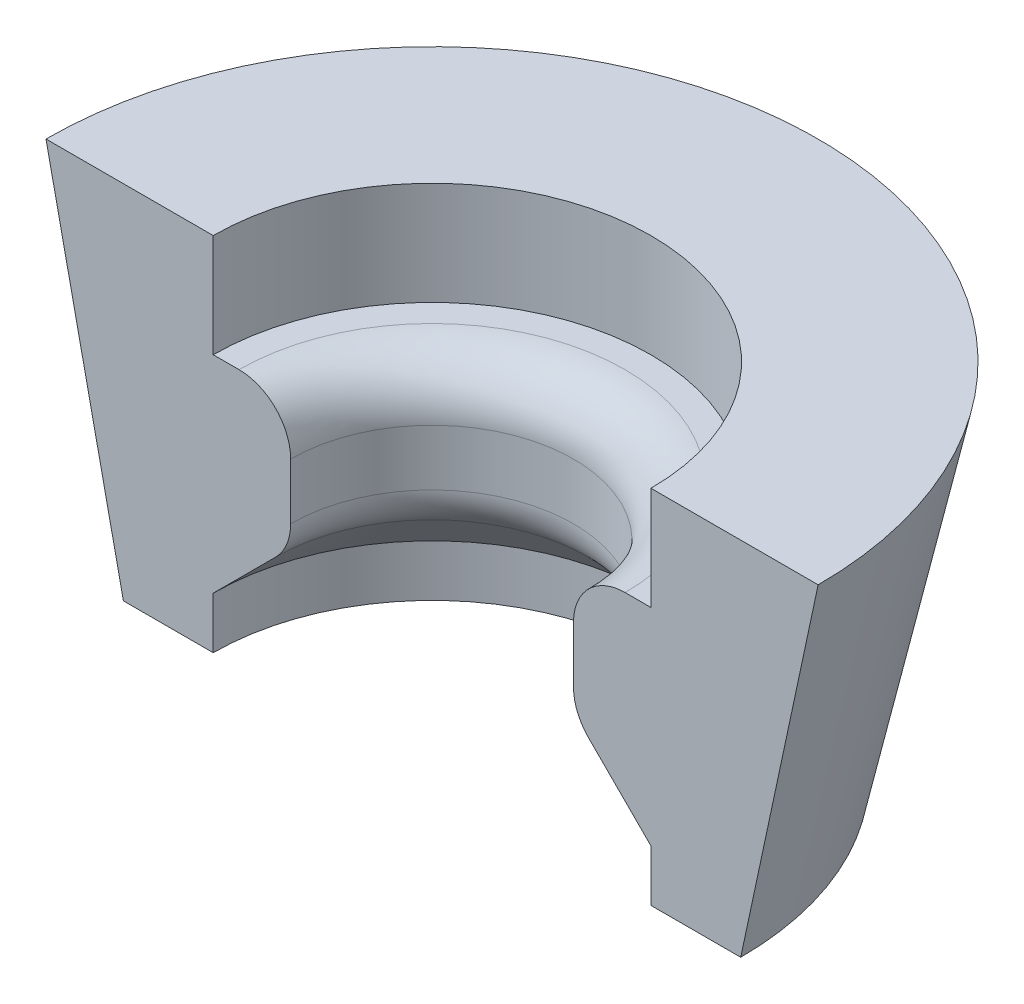
ISO-10303-21;
HEADER;
FILE_DESCRIPTION(('STEP AP214'),'2;1');
FILE_NAME('part.step','',(''),(''),'','','');
FILE_SCHEMA(('AUTOMOTIVE_DESIGN { 1 0 10303 214 1 1 1 1 }'));
ENDSEC;
DATA;
#1=APPLICATION_CONTEXT('core data for automotive mechanical design processes');
#2=APPLICATION_PROTOCOL_DEFINITION('international standard','automotive_design',2000,#1);
#3=PRODUCT_CONTEXT('',#1,'mechanical');
#4=PRODUCT('Part','Part','',(#3));
#5=PRODUCT_RELATED_PRODUCT_CATEGORY('part','',(#4));
#6=PRODUCT_DEFINITION_FORMATION('','',#4);
#7=PRODUCT_DEFINITION_CONTEXT('part definition',#1,'design');
#8=PRODUCT_DEFINITION('design','',#6,#7);
#9=PRODUCT_DEFINITION_SHAPE('','',#8);
#10=(LENGTH_UNIT() NAMED_UNIT(*) SI_UNIT(.MILLI.,.METRE.));
#11=(NAMED_UNIT(*) PLANE_ANGLE_UNIT() SI_UNIT($,.RADIAN.));
#12=(NAMED_UNIT(*) SI_UNIT($,.STERADIAN.) SOLID_ANGLE_UNIT());
#13=UNCERTAINTY_MEASURE_WITH_UNIT(LENGTH_MEASURE(1.E-05),#10,'distance_accuracy_value','');
#14=(GEOMETRIC_REPRESENTATION_CONTEXT(3) GLOBAL_UNCERTAINTY_ASSIGNED_CONTEXT((#13)) GLOBAL_UNIT_ASSIGNED_CONTEXT((#10,
#11,#12)) REPRESENTATION_CONTEXT('',''));
#15=CARTESIAN_POINT('',(0.,0.,0.));
#16=DIRECTION('',(0.,0.,1.));
#17=DIRECTION('',(1.,0.,0.));
#18=AXIS2_PLACEMENT_3D('',#15,#16,#17);
#19=CARTESIAN_POINT('',(3.3655,1.5875,0.));
#20=DIRECTION('',(0.,1.,0.));
#21=DIRECTION('',(-1.,0.,0.));
#22=AXIS2_PLACEMENT_3D('',#19,#20,#21);
#23=PLANE('',#22);
#24=CARTESIAN_POINT('',(0.,1.5875,0.));
#25=DIRECTION('',(0.,1.,0.));
#26=DIRECTION('',(-1.,0.,0.));
#27=AXIS2_PLACEMENT_3D('',#24,#25,#26);
#28=CIRCLE('',#27,2.968625);
#29=CARTESIAN_POINT('',(2.968625,1.5875,0.));
#30=VERTEX_POINT('',#29);
#31=CARTESIAN_POINT('',(-2.968625,1.5875,0.));
#32=VERTEX_POINT('',#31);
#33=EDGE_CURVE('E11',#30,#32,#28,.T.);
#34=ORIENTED_EDGE('',*,*,#33,.F.);
#35=DIRECTION('',(1.,0.,0.));
#36=VECTOR('',#35,1.);
#37=CARTESIAN_POINT('',(3.3655,1.5875,0.));
#38=LINE('',#37,#36);
#39=CARTESIAN_POINT('',(3.3655,1.5875,0.));
#40=VERTEX_POINT('',#39);
#41=EDGE_CURVE('E111',#30,#40,#38,.T.);
#42=ORIENTED_EDGE('',*,*,#41,.T.);
#43=CARTESIAN_POINT('',(0.,1.5875,0.));
#44=DIRECTION('',(0.,1.,0.));
#45=DIRECTION('',(-1.,0.,0.));
#46=AXIS2_PLACEMENT_3D('',#43,#44,#45);
#47=CIRCLE('',#46,3.3655);
#48=CARTESIAN_POINT('',(-3.3655,1.5875,0.));
#49=VERTEX_POINT('',#48);
#50=EDGE_CURVE('E106',#40,#49,#47,.T.);
#51=ORIENTED_EDGE('',*,*,#50,.T.);
#52=DIRECTION('',(-1.,0.,0.));
#53=VECTOR('',#52,1.);
#54=CARTESIAN_POINT('',(-3.3655,1.5875,0.));
#55=LINE('',#54,#53);
#56=EDGE_CURVE('E109',#32,#49,#55,.T.);
#57=ORIENTED_EDGE('',*,*,#56,.F.);
#58=EDGE_LOOP('',(#34,#42,#51,#57));
#59=FACE_BOUND('',#58,.T.);
#60=ADVANCED_FACE('F34',(#59),#23,.T.);
#61=CARTESIAN_POINT('',(0.,0.793750000000001,0.));
#62=DIRECTION('',(0.,1.,0.));
#63=DIRECTION('',(-1.,0.,0.));
#64=AXIS2_PLACEMENT_3D('',#61,#62,#63);
#65=TOROIDAL_SURFACE('',#64,2.968625,0.79375);
#66=CARTESIAN_POINT('',(0.,0.793750000000001,0.));
#67=DIRECTION('',(0.,1.,0.));
#68=DIRECTION('',(-1.,0.,0.));
#69=AXIS2_PLACEMENT_3D('',#66,#67,#68);
#70=CIRCLE('',#69,2.174875);
#71=CARTESIAN_POINT('',(2.174875,0.793750000000002,0.));
#72=VERTEX_POINT('',#71);
#73=CARTESIAN_POINT('',(-2.174875,0.793750000000001,0.));
#74=VERTEX_POINT('',#73);
#75=EDGE_CURVE('E42',#72,#74,#70,.T.);
#76=ORIENTED_EDGE('',*,*,#75,.F.);
#77=CARTESIAN_POINT('',(2.968625,0.793750000000002,0.));
#78=DIRECTION('',(0.,0.,-1.));
#79=DIRECTION('',(1.,0.,0.));
#80=AXIS2_PLACEMENT_3D('',#77,#78,#79);
#81=CIRCLE('',#80,0.79375);
#82=EDGE_CURVE('E116',#72,#30,#81,.T.);
#83=ORIENTED_EDGE('',*,*,#82,.T.);
#84=ORIENTED_EDGE('',*,*,#33,.T.);
#85=CARTESIAN_POINT('',(-2.968625,0.793750000000001,0.));
#86=DIRECTION('',(0.,0.,1.));
#87=DIRECTION('',(-1.,0.,0.));
#88=AXIS2_PLACEMENT_3D('',#85,#86,#87);
#89=CIRCLE('',#88,0.79375);
#90=EDGE_CURVE('E129',#74,#32,#89,.T.);
#91=ORIENTED_EDGE('',*,*,#90,.F.);
#92=EDGE_LOOP('',(#76,#83,#84,#91));
#93=FACE_BOUND('',#92,.T.);
#94=ADVANCED_FACE('F36',(#93),#65,.T.);
#95=CARTESIAN_POINT('',(0.,1.5875,0.));
#96=DIRECTION('',(0.,1.,0.));
#97=DIRECTION('',(-1.,0.,0.));
#98=AXIS2_PLACEMENT_3D('',#95,#96,#97);
#99=CYLINDRICAL_SURFACE('',#98,2.174875);
#100=CARTESIAN_POINT('',(0.,-0.0680929848663639,0.));
#101=DIRECTION('',(0.,1.,0.));
#102=DIRECTION('',(-1.,0.,0.));
#103=AXIS2_PLACEMENT_3D('',#100,#101,#102);
#104=CIRCLE('',#103,2.174875);
#105=CARTESIAN_POINT('',(2.174875,-0.0680929848663637,0.));
#106=VERTEX_POINT('',#105);
#107=CARTESIAN_POINT('',(-2.174875,-0.0680929848663643,0.));
#108=VERTEX_POINT('',#107);
#109=EDGE_CURVE('E186',#106,#108,#104,.T.);
#110=ORIENTED_EDGE('',*,*,#109,.F.);
#111=DIRECTION('',(0.,1.,0.));
#112=VECTOR('',#111,1.);
#113=CARTESIAN_POINT('',(2.174875,0.793750000000002,0.));
#114=LINE('',#113,#112);
#115=EDGE_CURVE('E172',#106,#72,#114,.T.);
#116=ORIENTED_EDGE('',*,*,#115,.T.);
#117=ORIENTED_EDGE('',*,*,#75,.T.);
#118=DIRECTION('',(0.,1.,0.));
#119=VECTOR('',#118,1.);
#120=CARTESIAN_POINT('',(-2.174875,0.793750000000001,0.));
#121=LINE('',#120,#119);
#122=EDGE_CURVE('E148',#108,#74,#121,.T.);
#123=ORIENTED_EDGE('',*,*,#122,.F.);
#124=EDGE_LOOP('',(#110,#116,#117,#123));
#125=FACE_BOUND('',#124,.T.);
#126=ADVANCED_FACE('F189',(#125),#99,.F.);
#127=CARTESIAN_POINT('',(0.,-0.0680929848663629,0.));
#128=DIRECTION('',(0.,1.,0.));
#129=DIRECTION('',(-1.,0.,0.));
#130=AXIS2_PLACEMENT_3D('',#127,#128,#129);
#131=TOROIDAL_SURFACE('',#130,2.968625,0.79375);
#132=CARTESIAN_POINT('',(0.,-0.629358992433189,0.));
#133=DIRECTION('',(0.,1.,0.));
#134=DIRECTION('',(-1.,0.,0.));
#135=AXIS2_PLACEMENT_3D('',#132,#133,#134);
#136=CIRCLE('',#135,2.40735899243318);
#137=CARTESIAN_POINT('',(2.40735899243318,-0.629358992433189,0.));
#138=VERTEX_POINT('',#137);
#139=CARTESIAN_POINT('',(-2.40735899243318,-0.629358992433189,0.));
#140=VERTEX_POINT('',#139);
#141=EDGE_CURVE('E184',#138,#140,#136,.T.);
#142=ORIENTED_EDGE('',*,*,#141,.F.);
#143=CARTESIAN_POINT('',(2.968625,-0.0680929848663625,0.));
#144=DIRECTION('',(0.,0.,-1.));
#145=DIRECTION('',(1.,0.,0.));
#146=AXIS2_PLACEMENT_3D('',#143,#144,#145);
#147=CIRCLE('',#146,0.79375);
#148=EDGE_CURVE('E169',#138,#106,#147,.T.);
#149=ORIENTED_EDGE('',*,*,#148,.T.);
#150=ORIENTED_EDGE('',*,*,#109,.T.);
#151=CARTESIAN_POINT('',(-2.968625,-0.0680929848663633,0.));
#152=DIRECTION('',(0.,0.,1.));
#153=DIRECTION('',(-1.,0.,0.));
#154=AXIS2_PLACEMENT_3D('',#151,#152,#153);
#155=CIRCLE('',#154,0.79375);
#156=EDGE_CURVE('E145',#140,#108,#155,.T.);
#157=ORIENTED_EDGE('',*,*,#156,.F.);
#158=EDGE_LOOP('',(#142,#149,#150,#157));
#159=FACE_BOUND('',#158,.T.);
#160=ADVANCED_FACE('F216',(#159),#131,.T.);
#161=CARTESIAN_POINT('',(0.,-1.5875,0.));
#162=DIRECTION('',(0.,-1.,0.));
#163=DIRECTION('',(1.,0.,0.));
#164=AXIS2_PLACEMENT_3D('',#161,#162,#163);
#165=CONICAL_SURFACE('',#164,3.3655,0.785398163397454);
#166=CARTESIAN_POINT('',(0.,-1.5875,0.));
#167=DIRECTION('',(0.,1.,0.));
#168=DIRECTION('',(-1.,0.,0.));
#169=AXIS2_PLACEMENT_3D('',#166,#167,#168);
#170=CIRCLE('',#169,3.3655);
#171=CARTESIAN_POINT('',(3.3655,-1.5875,0.));
#172=VERTEX_POINT('',#171);
#173=CARTESIAN_POINT('',(-3.3655,-1.5875,0.));
#174=VERTEX_POINT('',#173);
#175=EDGE_CURVE('E182',#172,#174,#170,.T.);
#176=ORIENTED_EDGE('',*,*,#175,.F.);
#177=DIRECTION('',(-0.707106781186551,0.707106781186544,0.));
#178=VECTOR('',#177,1.);
#179=CARTESIAN_POINT('',(2.40735899243318,-0.629358992433189,0.));
#180=LINE('',#179,#178);
#181=EDGE_CURVE('E166',#172,#138,#180,.T.);
#182=ORIENTED_EDGE('',*,*,#181,.T.);
#183=ORIENTED_EDGE('',*,*,#141,.T.);
#184=DIRECTION('',(0.707106781186551,0.707106781186544,0.));
#185=VECTOR('',#184,1.);
#186=CARTESIAN_POINT('',(-2.40735899243318,-0.629358992433189,0.));
#187=LINE('',#186,#185);
#188=EDGE_CURVE('E142',#174,#140,#187,.T.);
#189=ORIENTED_EDGE('',*,*,#188,.F.);
#190=EDGE_LOOP('',(#176,#182,#183,#189));
#191=FACE_BOUND('',#190,.T.);
#192=ADVANCED_FACE('F213',(#191),#165,.F.);
#193=CARTESIAN_POINT('',(0.,1.5875,0.));
#194=DIRECTION('',(0.,1.,0.));
#195=DIRECTION('',(-1.,0.,0.));
#196=AXIS2_PLACEMENT_3D('',#193,#194,#195);
#197=CYLINDRICAL_SURFACE('',#196,3.3655);
#198=CARTESIAN_POINT('',(0.,-2.38125,0.));
#199=DIRECTION('',(0.,1.,0.));
#200=DIRECTION('',(-1.,0.,0.));
#201=AXIS2_PLACEMENT_3D('',#198,#199,#200);
#202=CIRCLE('',#201,3.3655);
#203=CARTESIAN_POINT('',(3.3655,-2.38125,0.));
#204=VERTEX_POINT('',#203);
#205=CARTESIAN_POINT('',(-3.3655,-2.38125,0.));
#206=VERTEX_POINT('',#205);
#207=EDGE_CURVE('E180',#204,#206,#202,.T.);
#208=ORIENTED_EDGE('',*,*,#207,.F.);
#209=DIRECTION('',(0.,1.,0.));
#210=VECTOR('',#209,1.);
#211=CARTESIAN_POINT('',(3.3655,-2.38125,0.));
#212=LINE('',#211,#210);
#213=EDGE_CURVE('E163',#204,#172,#212,.T.);
#214=ORIENTED_EDGE('',*,*,#213,.T.);
#215=ORIENTED_EDGE('',*,*,#175,.T.);
#216=DIRECTION('',(0.,1.,0.));
#217=VECTOR('',#216,1.);
#218=CARTESIAN_POINT('',(-3.3655,-2.38125,0.));
#219=LINE('',#218,#217);
#220=EDGE_CURVE('E139',#206,#174,#219,.T.);
#221=ORIENTED_EDGE('',*,*,#220,.F.);
#222=EDGE_LOOP('',(#208,#214,#215,#221));
#223=FACE_BOUND('',#222,.T.);
#224=ADVANCED_FACE('F210',(#223),#197,.F.);
#225=CARTESIAN_POINT('',(4.746625,-2.38125,0.));
#226=DIRECTION('',(0.,-1.,0.));
#227=DIRECTION('',(1.,0.,0.));
#228=AXIS2_PLACEMENT_3D('',#225,#226,#227);
#229=PLANE('',#228);
#230=CARTESIAN_POINT('',(0.,-2.38125,0.));
#231=DIRECTION('',(0.,1.,0.));
#232=DIRECTION('',(-1.,0.,0.));
#233=AXIS2_PLACEMENT_3D('',#230,#231,#232);
#234=CIRCLE('',#233,4.746625);
#235=CARTESIAN_POINT('',(4.746625,-2.38125,0.));
#236=VERTEX_POINT('',#235);
#237=CARTESIAN_POINT('',(-4.746625,-2.38125,0.));
#238=VERTEX_POINT('',#237);
#239=EDGE_CURVE('E178',#236,#238,#234,.T.);
#240=ORIENTED_EDGE('',*,*,#239,.F.);
#241=DIRECTION('',(-1.,0.,0.));
#242=VECTOR('',#241,1.);
#243=CARTESIAN_POINT('',(4.746625,-2.38125,0.));
#244=LINE('',#243,#242);
#245=EDGE_CURVE('E160',#236,#204,#244,.T.);
#246=ORIENTED_EDGE('',*,*,#245,.T.);
#247=ORIENTED_EDGE('',*,*,#207,.T.);
#248=DIRECTION('',(1.,0.,0.));
#249=VECTOR('',#248,1.);
#250=CARTESIAN_POINT('',(-4.746625,-2.38125,0.));
#251=LINE('',#250,#249);
#252=EDGE_CURVE('E136',#238,#206,#251,.T.);
#253=ORIENTED_EDGE('',*,*,#252,.F.);
#254=EDGE_LOOP('',(#240,#246,#247,#253));
#255=FACE_BOUND('',#254,.T.);
#256=ADVANCED_FACE('F205',(#255),#229,.T.);
#257=CARTESIAN_POINT('',(0.,3.175,0.));
#258=DIRECTION('',(0.,1.,0.));
#259=DIRECTION('',(-1.,0.,0.));
#260=AXIS2_PLACEMENT_3D('',#257,#258,#259);
#261=CONICAL_SURFACE('',#260,5.93725,0.211093333222746);
#262=CARTESIAN_POINT('',(0.,3.175,0.));
#263=DIRECTION('',(0.,1.,0.));
#264=DIRECTION('',(-1.,0.,0.));
#265=AXIS2_PLACEMENT_3D('',#262,#263,#264);
#266=CIRCLE('',#265,5.93725);
#267=CARTESIAN_POINT('',(5.93725,3.175,0.));
#268=VERTEX_POINT('',#267);
#269=CARTESIAN_POINT('',(-5.93725,3.175,0.));
#270=VERTEX_POINT('',#269);
#271=EDGE_CURVE('E176',#268,#270,#266,.T.);
#272=ORIENTED_EDGE('',*,*,#271,.F.);
#273=DIRECTION('',(-0.209529088730873,-0.97780241407741,0.));
#274=VECTOR('',#273,1.);
#275=CARTESIAN_POINT('',(5.93725,3.175,0.));
#276=LINE('',#275,#274);
#277=EDGE_CURVE('E157',#268,#236,#276,.T.);
#278=ORIENTED_EDGE('',*,*,#277,.T.);
#279=ORIENTED_EDGE('',*,*,#239,.T.);
#280=DIRECTION('',(0.209529088730873,-0.977802414077409,0.));
#281=VECTOR('',#280,1.);
#282=CARTESIAN_POINT('',(-5.93725,3.175,0.));
#283=LINE('',#282,#281);
#284=EDGE_CURVE('E133',#270,#238,#283,.T.);
#285=ORIENTED_EDGE('',*,*,#284,.F.);
#286=EDGE_LOOP('',(#272,#278,#279,#285));
#287=FACE_BOUND('',#286,.T.);
#288=ADVANCED_FACE('F203',(#287),#261,.T.);
#289=CARTESIAN_POINT('',(3.3655,3.175,0.));
#290=DIRECTION('',(0.,1.,0.));
#291=DIRECTION('',(-1.,0.,0.));
#292=AXIS2_PLACEMENT_3D('',#289,#290,#291);
#293=PLANE('',#292);
#294=CARTESIAN_POINT('',(0.,3.175,0.));
#295=DIRECTION('',(0.,1.,0.));
#296=DIRECTION('',(-1.,0.,0.));
#297=AXIS2_PLACEMENT_3D('',#294,#295,#296);
#298=CIRCLE('',#297,3.3655);
#299=CARTESIAN_POINT('',(3.3655,3.175,0.));
#300=VERTEX_POINT('',#299);
#301=CARTESIAN_POINT('',(-3.3655,3.175,0.));
#302=VERTEX_POINT('',#301);
#303=EDGE_CURVE('E115',#300,#302,#298,.T.);
#304=ORIENTED_EDGE('',*,*,#303,.F.);
#305=DIRECTION('',(1.,0.,0.));
#306=VECTOR('',#305,1.);
#307=CARTESIAN_POINT('',(3.3655,3.175,0.));
#308=LINE('',#307,#306);
#309=EDGE_CURVE('E154',#300,#268,#308,.T.);
#310=ORIENTED_EDGE('',*,*,#309,.T.);
#311=ORIENTED_EDGE('',*,*,#271,.T.);
#312=DIRECTION('',(-1.,0.,0.));
#313=VECTOR('',#312,1.);
#314=CARTESIAN_POINT('',(-3.3655,3.175,0.));
#315=LINE('',#314,#313);
#316=EDGE_CURVE('E124',#302,#270,#315,.T.);
#317=ORIENTED_EDGE('',*,*,#316,.F.);
#318=EDGE_LOOP('',(#304,#310,#311,#317));
#319=FACE_BOUND('',#318,.T.);
#320=ADVANCED_FACE('F199',(#319),#293,.T.);
#321=CARTESIAN_POINT('',(0.,1.5875,0.));
#322=DIRECTION('',(0.,1.,0.));
#323=DIRECTION('',(-1.,0.,0.));
#324=AXIS2_PLACEMENT_3D('',#321,#322,#323);
#325=CYLINDRICAL_SURFACE('',#324,3.3655);
#326=DIRECTION('',(0.,1.,0.));
#327=VECTOR('',#326,1.);
#328=CARTESIAN_POINT('',(3.3655,1.5875,0.));
#329=LINE('',#328,#327);
#330=EDGE_CURVE('E152',#40,#300,#329,.T.);
#331=ORIENTED_EDGE('',*,*,#330,.T.);
#332=ORIENTED_EDGE('',*,*,#303,.T.);
#333=DIRECTION('',(0.,1.,0.));
#334=VECTOR('',#333,1.);
#335=CARTESIAN_POINT('',(-3.3655,1.5875,0.));
#336=LINE('',#335,#334);
#337=EDGE_CURVE('E119',#49,#302,#336,.T.);
#338=ORIENTED_EDGE('',*,*,#337,.F.);
#339=ORIENTED_EDGE('',*,*,#50,.F.);
#340=EDGE_LOOP('',(#331,#332,#338,#339));
#341=FACE_BOUND('',#340,.T.);
#342=ADVANCED_FACE('F120',(#341),#325,.F.);
#343=CARTESIAN_POINT('',(2.968625,0.793750000000002,0.));
#344=DIRECTION('',(0.,0.,1.));
#345=DIRECTION('',(1.,0.,0.));
#346=AXIS2_PLACEMENT_3D('',#343,#344,#345);
#347=PLANE('',#346);
#348=ORIENTED_EDGE('',*,*,#41,.F.);
#349=ORIENTED_EDGE('',*,*,#82,.F.);
#350=ORIENTED_EDGE('',*,*,#115,.F.);
#351=ORIENTED_EDGE('',*,*,#148,.F.);
#352=ORIENTED_EDGE('',*,*,#181,.F.);
#353=ORIENTED_EDGE('',*,*,#213,.F.);
#354=ORIENTED_EDGE('',*,*,#245,.F.);
#355=ORIENTED_EDGE('',*,*,#277,.F.);
#356=ORIENTED_EDGE('',*,*,#309,.F.);
#357=ORIENTED_EDGE('',*,*,#330,.F.);
#358=EDGE_LOOP('',(#348,#349,#350,#351,#352,#353,#354,#355,#356,#357));
#359=FACE_BOUND('',#358,.T.);
#360=ADVANCED_FACE('F194',(#359),#347,.T.);
#361=CARTESIAN_POINT('',(-2.968625,0.793750000000001,0.));
#362=DIRECTION('',(0.,0.,-1.));
#363=DIRECTION('',(-1.,0.,0.));
#364=AXIS2_PLACEMENT_3D('',#361,#362,#363);
#365=PLANE('',#364);
#366=ORIENTED_EDGE('',*,*,#56,.T.);
#367=ORIENTED_EDGE('',*,*,#337,.T.);
#368=ORIENTED_EDGE('',*,*,#316,.T.);
#369=ORIENTED_EDGE('',*,*,#284,.T.);
#370=ORIENTED_EDGE('',*,*,#252,.T.);
#371=ORIENTED_EDGE('',*,*,#220,.T.);
#372=ORIENTED_EDGE('',*,*,#188,.T.);
#373=ORIENTED_EDGE('',*,*,#156,.T.);
#374=ORIENTED_EDGE('',*,*,#122,.T.);
#375=ORIENTED_EDGE('',*,*,#90,.T.);
#376=EDGE_LOOP('',(#366,#367,#368,#369,#370,#371,#372,#373,#374,#375));
#377=FACE_BOUND('',#376,.T.);
#378=ADVANCED_FACE('F127',(#377),#365,.F.);
#379=CLOSED_SHELL('',(#60,#94,#126,#160,#192,#224,#256,#288,#320,#342,#360,#378));
#380=MANIFOLD_SOLID_BREP('B2',#379);
#381=ADVANCED_BREP_SHAPE_REPRESENTATION('',(#18,#380),#14);
#382=SHAPE_DEFINITION_REPRESENTATION(#9,#381);
ENDSEC;
END-ISO-10303-21;
